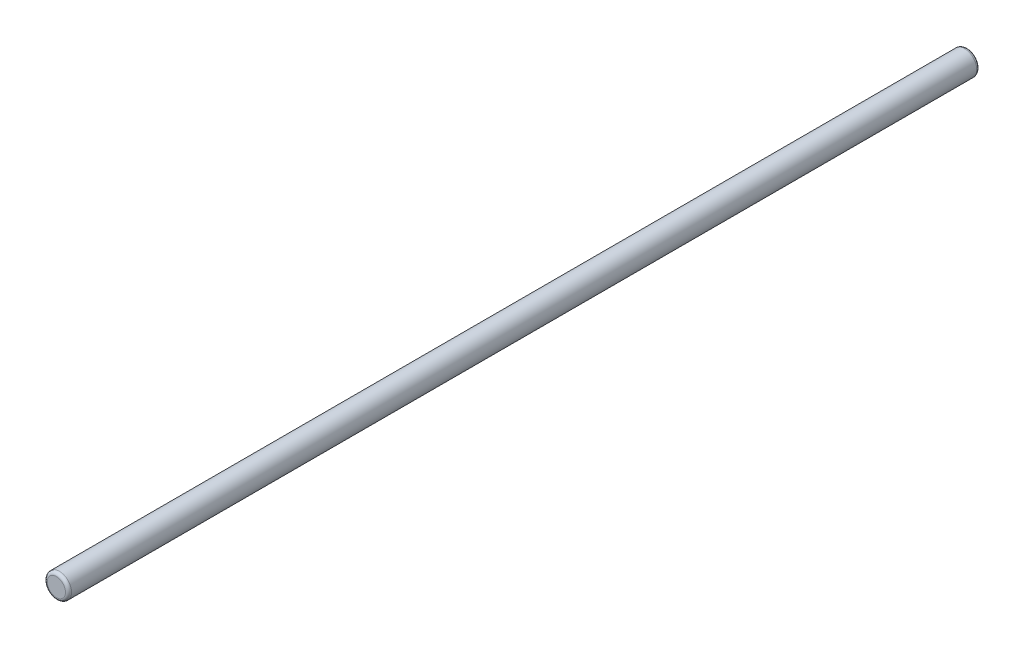
ISO-10303-21;
HEADER;
FILE_DESCRIPTION(('STEP AP214'),'2;1');
FILE_NAME('part.step','',(''),(''),'','','');
FILE_SCHEMA(('AUTOMOTIVE_DESIGN { 1 0 10303 214 1 1 1 1 }'));
ENDSEC;
DATA;
#1=APPLICATION_CONTEXT('core data for automotive mechanical design processes');
#2=APPLICATION_PROTOCOL_DEFINITION('international standard','automotive_design',2000,#1);
#3=PRODUCT_CONTEXT('',#1,'mechanical');
#4=PRODUCT('Part','Part','',(#3));
#5=PRODUCT_RELATED_PRODUCT_CATEGORY('part','',(#4));
#6=PRODUCT_DEFINITION_FORMATION('','',#4);
#7=PRODUCT_DEFINITION_CONTEXT('part definition',#1,'design');
#8=PRODUCT_DEFINITION('design','',#6,#7);
#9=PRODUCT_DEFINITION_SHAPE('','',#8);
#10=(LENGTH_UNIT() NAMED_UNIT(*) SI_UNIT(.MILLI.,.METRE.));
#11=(NAMED_UNIT(*) PLANE_ANGLE_UNIT() SI_UNIT($,.RADIAN.));
#12=(NAMED_UNIT(*) SI_UNIT($,.STERADIAN.) SOLID_ANGLE_UNIT());
#13=UNCERTAINTY_MEASURE_WITH_UNIT(LENGTH_MEASURE(1.E-05),#10,'distance_accuracy_value','');
#14=(GEOMETRIC_REPRESENTATION_CONTEXT(3) GLOBAL_UNCERTAINTY_ASSIGNED_CONTEXT((#13)) GLOBAL_UNIT_ASSIGNED_CONTEXT((#10,
#11,#12)) REPRESENTATION_CONTEXT('',''));
#15=CARTESIAN_POINT('',(0.,0.,0.));
#16=DIRECTION('',(0.,0.,1.));
#17=DIRECTION('',(1.,0.,0.));
#18=AXIS2_PLACEMENT_3D('',#15,#16,#17);
#19=CARTESIAN_POINT('',(0.,0.,300.));
#20=DIRECTION('',(0.,0.,-1.));
#21=DIRECTION('',(-1.,0.,0.));
#22=AXIS2_PLACEMENT_3D('',#19,#20,#21);
#23=CYLINDRICAL_SURFACE('',#22,4.);
#24=CARTESIAN_POINT('',(0.,0.,1.));
#25=DIRECTION('',(0.,0.,1.));
#26=DIRECTION('',(1.,0.,0.));
#27=AXIS2_PLACEMENT_3D('',#24,#25,#26);
#28=CIRCLE('',#27,4.);
#29=CARTESIAN_POINT('',(4.,0.,1.));
#30=VERTEX_POINT('',#29);
#31=EDGE_CURVE('E42',#30,#30,#28,.T.);
#32=ORIENTED_EDGE('',*,*,#31,.T.);
#33=EDGE_LOOP('',(#32));
#34=FACE_BOUND('',#33,.T.);
#35=CARTESIAN_POINT('',(0.,0.,299.));
#36=DIRECTION('',(0.,0.,1.));
#37=DIRECTION('',(1.,0.,0.));
#38=AXIS2_PLACEMENT_3D('',#35,#36,#37);
#39=CIRCLE('',#38,4.);
#40=CARTESIAN_POINT('',(4.,0.,299.));
#41=VERTEX_POINT('',#40);
#42=EDGE_CURVE('E46',#41,#41,#39,.F.);
#43=ORIENTED_EDGE('',*,*,#42,.T.);
#44=EDGE_LOOP('',(#43));
#45=FACE_BOUND('',#44,.T.);
#46=ADVANCED_FACE('F31',(#34,#45),#23,.T.);
#47=CARTESIAN_POINT('',(0.,0.,300.));
#48=DIRECTION('',(0.,0.,1.));
#49=DIRECTION('',(1.,0.,0.));
#50=AXIS2_PLACEMENT_3D('',#47,#48,#49);
#51=PLANE('',#50);
#52=CARTESIAN_POINT('',(0.,0.,300.));
#53=DIRECTION('',(0.,0.,1.));
#54=DIRECTION('',(1.,0.,0.));
#55=AXIS2_PLACEMENT_3D('',#52,#53,#54);
#56=CIRCLE('',#55,3.);
#57=CARTESIAN_POINT('',(3.,0.,300.));
#58=VERTEX_POINT('',#57);
#59=EDGE_CURVE('E10',#58,#58,#56,.T.);
#60=ORIENTED_EDGE('',*,*,#59,.T.);
#61=EDGE_LOOP('',(#60));
#62=FACE_BOUND('',#61,.T.);
#63=ADVANCED_FACE('F62',(#62),#51,.T.);
#64=CARTESIAN_POINT('',(0.,0.,0.));
#65=DIRECTION('',(0.,0.,1.));
#66=DIRECTION('',(1.,0.,0.));
#67=AXIS2_PLACEMENT_3D('',#64,#65,#66);
#68=PLANE('',#67);
#69=CARTESIAN_POINT('',(0.,0.,0.));
#70=DIRECTION('',(0.,0.,1.));
#71=DIRECTION('',(1.,0.,0.));
#72=AXIS2_PLACEMENT_3D('',#69,#70,#71);
#73=CIRCLE('',#72,3.);
#74=CARTESIAN_POINT('',(3.,0.,0.));
#75=VERTEX_POINT('',#74);
#76=EDGE_CURVE('E38',#75,#75,#73,.F.);
#77=ORIENTED_EDGE('',*,*,#76,.T.);
#78=EDGE_LOOP('',(#77));
#79=FACE_BOUND('',#78,.T.);
#80=ADVANCED_FACE('F59',(#79),#68,.F.);
#81=CARTESIAN_POINT('',(0.,0.,1.));
#82=DIRECTION('',(0.,0.,1.));
#83=DIRECTION('',(1.,0.,0.));
#84=AXIS2_PLACEMENT_3D('',#81,#82,#83);
#85=TOROIDAL_SURFACE('',#84,3.,1.);
#86=ORIENTED_EDGE('',*,*,#76,.F.);
#87=EDGE_LOOP('',(#86));
#88=FACE_BOUND('',#87,.T.);
#89=ORIENTED_EDGE('',*,*,#31,.F.);
#90=EDGE_LOOP('',(#89));
#91=FACE_BOUND('',#90,.T.);
#92=ADVANCED_FACE('F55',(#88,#91),#85,.T.);
#93=CARTESIAN_POINT('',(0.,0.,299.));
#94=DIRECTION('',(0.,0.,1.));
#95=DIRECTION('',(1.,0.,0.));
#96=AXIS2_PLACEMENT_3D('',#93,#94,#95);
#97=TOROIDAL_SURFACE('',#96,3.,1.);
#98=ORIENTED_EDGE('',*,*,#42,.F.);
#99=EDGE_LOOP('',(#98));
#100=FACE_BOUND('',#99,.T.);
#101=ORIENTED_EDGE('',*,*,#59,.F.);
#102=EDGE_LOOP('',(#101));
#103=FACE_BOUND('',#102,.T.);
#104=ADVANCED_FACE('F33',(#100,#103),#97,.T.);
#105=CLOSED_SHELL('',(#46,#63,#80,#92,#104));
#106=MANIFOLD_SOLID_BREP('B2',#105);
#107=ADVANCED_BREP_SHAPE_REPRESENTATION('',(#18,#106),#14);
#108=SHAPE_DEFINITION_REPRESENTATION(#9,#107);
ENDSEC;
END-ISO-10303-21;
